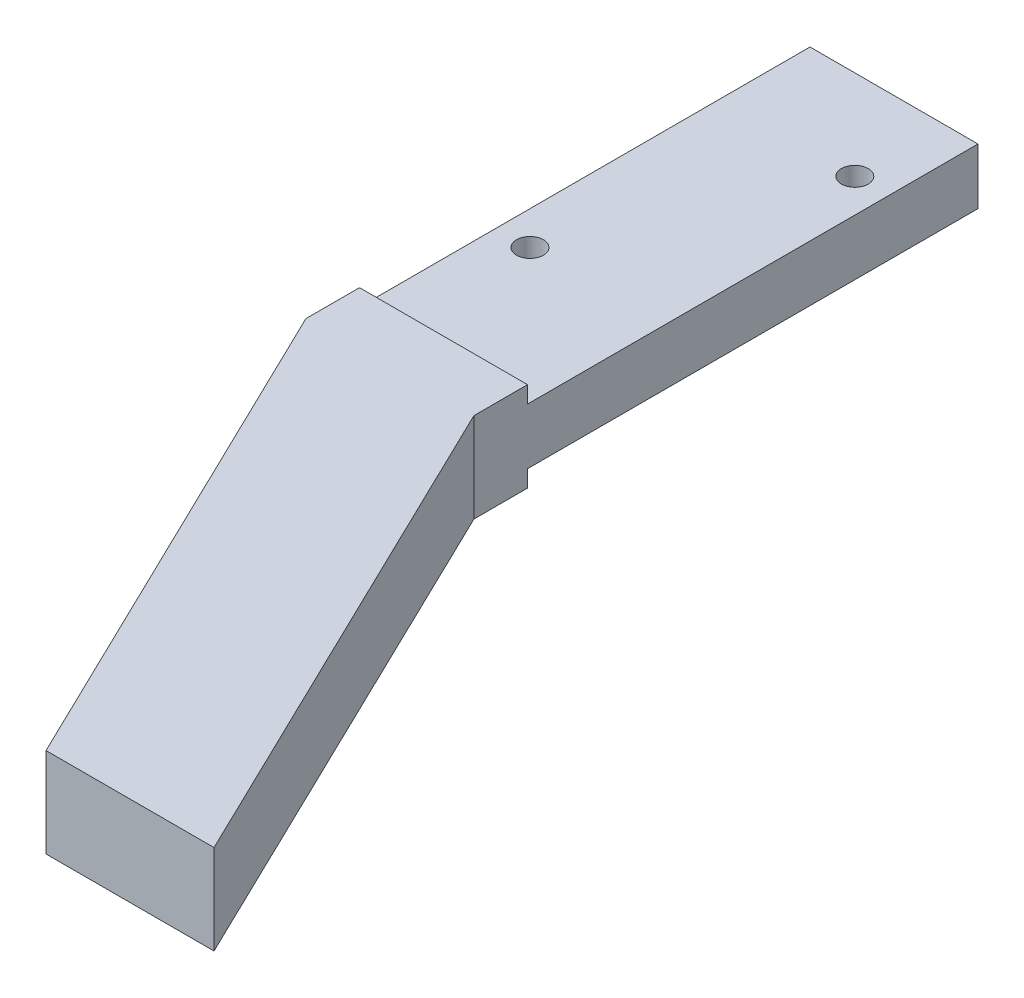
ISO-10303-21;
HEADER;
FILE_DESCRIPTION(('STEP AP214'),'2;1');
FILE_NAME('part.step','',(''),(''),'','','');
FILE_SCHEMA(('AUTOMOTIVE_DESIGN { 1 0 10303 214 1 1 1 1 }'));
ENDSEC;
DATA;
#1=APPLICATION_CONTEXT('core data for automotive mechanical design processes');
#2=APPLICATION_PROTOCOL_DEFINITION('international standard','automotive_design',2000,#1);
#3=PRODUCT_CONTEXT('',#1,'mechanical');
#4=PRODUCT('Part','Part','',(#3));
#5=PRODUCT_RELATED_PRODUCT_CATEGORY('part','',(#4));
#6=PRODUCT_DEFINITION_FORMATION('','',#4);
#7=PRODUCT_DEFINITION_CONTEXT('part definition',#1,'design');
#8=PRODUCT_DEFINITION('design','',#6,#7);
#9=PRODUCT_DEFINITION_SHAPE('','',#8);
#10=(LENGTH_UNIT() NAMED_UNIT(*) SI_UNIT(.MILLI.,.METRE.));
#11=(NAMED_UNIT(*) PLANE_ANGLE_UNIT() SI_UNIT($,.RADIAN.));
#12=(NAMED_UNIT(*) SI_UNIT($,.STERADIAN.) SOLID_ANGLE_UNIT());
#13=UNCERTAINTY_MEASURE_WITH_UNIT(LENGTH_MEASURE(1.E-05),#10,'distance_accuracy_value','');
#14=(GEOMETRIC_REPRESENTATION_CONTEXT(3) GLOBAL_UNCERTAINTY_ASSIGNED_CONTEXT((#13)) GLOBAL_UNIT_ASSIGNED_CONTEXT((#10,
#11,#12)) REPRESENTATION_CONTEXT('',''));
#15=CARTESIAN_POINT('',(0.,0.,0.));
#16=DIRECTION('',(0.,0.,1.));
#17=DIRECTION('',(1.,0.,0.));
#18=AXIS2_PLACEMENT_3D('',#15,#16,#17);
#19=CARTESIAN_POINT('',(0.,2.5,0.));
#20=DIRECTION('',(0.,1.,0.));
#21=DIRECTION('',(0.,0.,1.));
#22=AXIS2_PLACEMENT_3D('',#19,#20,#21);
#23=PLANE('',#22);
#24=DIRECTION('',(-1.,0.,0.));
#25=VECTOR('',#24,1.);
#26=CARTESIAN_POINT('',(0.,2.5,17.7156622283973));
#27=LINE('',#26,#25);
#28=CARTESIAN_POINT('',(7.5,2.5,17.7156622283973));
#29=VERTEX_POINT('',#28);
#30=CARTESIAN_POINT('',(-7.5,2.5,17.7156622283973));
#31=VERTEX_POINT('',#30);
#32=EDGE_CURVE('E70',#29,#31,#27,.T.);
#33=ORIENTED_EDGE('',*,*,#32,.F.);
#34=DIRECTION('',(0.,0.,-1.));
#35=VECTOR('',#34,1.);
#36=CARTESIAN_POINT('',(7.5,2.5,22.5));
#37=LINE('',#36,#35);
#38=CARTESIAN_POINT('',(7.5,2.5,-22.5));
#39=VERTEX_POINT('',#38);
#40=EDGE_CURVE('E192',#29,#39,#37,.T.);
#41=ORIENTED_EDGE('',*,*,#40,.T.);
#42=DIRECTION('',(-1.,0.,0.));
#43=VECTOR('',#42,1.);
#44=CARTESIAN_POINT('',(7.5,2.5,-22.5));
#45=LINE('',#44,#43);
#46=CARTESIAN_POINT('',(-7.5,2.5,-22.5));
#47=VERTEX_POINT('',#46);
#48=EDGE_CURVE('E50',#39,#47,#45,.T.);
#49=ORIENTED_EDGE('',*,*,#48,.T.);
#50=DIRECTION('',(0.,0.,1.));
#51=VECTOR('',#50,1.);
#52=CARTESIAN_POINT('',(-7.5,2.5,22.5));
#53=LINE('',#52,#51);
#54=EDGE_CURVE('E190',#47,#31,#53,.T.);
#55=ORIENTED_EDGE('',*,*,#54,.T.);
#56=EDGE_LOOP('',(#33,#41,#49,#55));
#57=FACE_BOUND('',#56,.T.);
#58=CARTESIAN_POINT('',(4.5,2.5,-14.5));
#59=DIRECTION('',(0.,1.,0.));
#60=DIRECTION('',(0.,0.,1.));
#61=AXIS2_PLACEMENT_3D('',#58,#59,#60);
#62=CIRCLE('',#61,1.2);
#63=CARTESIAN_POINT('',(4.5,2.5,-13.3));
#64=VERTEX_POINT('',#63);
#65=EDGE_CURVE('E185',#64,#64,#62,.T.);
#66=ORIENTED_EDGE('',*,*,#65,.F.);
#67=EDGE_LOOP('',(#66));
#68=FACE_BOUND('',#67,.T.);
#69=CARTESIAN_POINT('',(-4.5,2.5,5.50000000000001));
#70=DIRECTION('',(0.,1.,0.));
#71=DIRECTION('',(0.,0.,1.));
#72=AXIS2_PLACEMENT_3D('',#69,#70,#71);
#73=CIRCLE('',#72,1.2);
#74=CARTESIAN_POINT('',(-4.5,2.5,6.70000000000001));
#75=VERTEX_POINT('',#74);
#76=EDGE_CURVE('E179',#75,#75,#73,.T.);
#77=ORIENTED_EDGE('',*,*,#76,.F.);
#78=EDGE_LOOP('',(#77));
#79=FACE_BOUND('',#78,.T.);
#80=ADVANCED_FACE('F33',(#57,#68,#79),#23,.T.);
#81=CARTESIAN_POINT('',(0.,-2.5,0.));
#82=DIRECTION('',(0.,1.,0.));
#83=DIRECTION('',(0.,0.,1.));
#84=AXIS2_PLACEMENT_3D('',#81,#82,#83);
#85=PLANE('',#84);
#86=DIRECTION('',(0.,0.,-1.));
#87=VECTOR('',#86,1.);
#88=CARTESIAN_POINT('',(7.5,-2.5,22.5));
#89=LINE('',#88,#87);
#90=CARTESIAN_POINT('',(7.5,-2.5,17.7156622283973));
#91=VERTEX_POINT('',#90);
#92=CARTESIAN_POINT('',(7.5,-2.5,-22.5));
#93=VERTEX_POINT('',#92);
#94=EDGE_CURVE('E61',#91,#93,#89,.T.);
#95=ORIENTED_EDGE('',*,*,#94,.F.);
#96=DIRECTION('',(-1.,0.,0.));
#97=VECTOR('',#96,1.);
#98=CARTESIAN_POINT('',(0.,-2.5,17.7156622283973));
#99=LINE('',#98,#97);
#100=CARTESIAN_POINT('',(-7.5,-2.5,17.7156622283973));
#101=VERTEX_POINT('',#100);
#102=EDGE_CURVE('E171',#91,#101,#99,.T.);
#103=ORIENTED_EDGE('',*,*,#102,.T.);
#104=DIRECTION('',(0.,0.,1.));
#105=VECTOR('',#104,1.);
#106=CARTESIAN_POINT('',(-7.5,-2.5,22.5));
#107=LINE('',#106,#105);
#108=CARTESIAN_POINT('',(-7.5,-2.5,-22.5));
#109=VERTEX_POINT('',#108);
#110=EDGE_CURVE('E121',#109,#101,#107,.T.);
#111=ORIENTED_EDGE('',*,*,#110,.F.);
#112=DIRECTION('',(-1.,0.,0.));
#113=VECTOR('',#112,1.);
#114=CARTESIAN_POINT('',(7.5,-2.5,-22.5));
#115=LINE('',#114,#113);
#116=EDGE_CURVE('E193',#93,#109,#115,.T.);
#117=ORIENTED_EDGE('',*,*,#116,.F.);
#118=EDGE_LOOP('',(#95,#103,#111,#117));
#119=FACE_BOUND('',#118,.T.);
#120=CARTESIAN_POINT('',(4.5,-2.5,-14.5));
#121=DIRECTION('',(0.,1.,0.));
#122=DIRECTION('',(0.,0.,1.));
#123=AXIS2_PLACEMENT_3D('',#120,#121,#122);
#124=CIRCLE('',#123,1.2);
#125=CARTESIAN_POINT('',(4.5,-2.5,-13.3));
#126=VERTEX_POINT('',#125);
#127=EDGE_CURVE('E182',#126,#126,#124,.T.);
#128=ORIENTED_EDGE('',*,*,#127,.T.);
#129=EDGE_LOOP('',(#128));
#130=FACE_BOUND('',#129,.T.);
#131=CARTESIAN_POINT('',(-4.5,-2.5,5.50000000000001));
#132=DIRECTION('',(0.,1.,0.));
#133=DIRECTION('',(0.,0.,1.));
#134=AXIS2_PLACEMENT_3D('',#131,#132,#133);
#135=CIRCLE('',#134,1.2);
#136=CARTESIAN_POINT('',(-4.5,-2.5,6.70000000000001));
#137=VERTEX_POINT('',#136);
#138=EDGE_CURVE('E178',#137,#137,#135,.T.);
#139=ORIENTED_EDGE('',*,*,#138,.T.);
#140=EDGE_LOOP('',(#139));
#141=FACE_BOUND('',#140,.T.);
#142=ADVANCED_FACE('F226',(#119,#130,#141),#85,.F.);
#143=CARTESIAN_POINT('',(-7.5,2.5,22.5));
#144=DIRECTION('',(1.,0.,0.));
#145=DIRECTION('',(0.,0.,-1.));
#146=AXIS2_PLACEMENT_3D('',#143,#144,#145);
#147=PLANE('',#146);
#148=ORIENTED_EDGE('',*,*,#110,.T.);
#149=DIRECTION('',(0.,1.,0.));
#150=VECTOR('',#149,1.);
#151=CARTESIAN_POINT('',(-7.5,-4.,17.7156622283973));
#152=LINE('',#151,#150);
#153=CARTESIAN_POINT('',(-7.5,-4.,17.7156622283973));
#154=VERTEX_POINT('',#153);
#155=EDGE_CURVE('E116',#154,#101,#152,.T.);
#156=ORIENTED_EDGE('',*,*,#155,.F.);
#157=DIRECTION('',(0.,0.,1.));
#158=VECTOR('',#157,1.);
#159=CARTESIAN_POINT('',(-7.5,-4.,17.7156622283973));
#160=LINE('',#159,#158);
#161=CARTESIAN_POINT('',(-7.5,-4.,22.5));
#162=VERTEX_POINT('',#161);
#163=EDGE_CURVE('E118',#154,#162,#160,.T.);
#164=ORIENTED_EDGE('',*,*,#163,.T.);
#165=DIRECTION('',(0.,-1.,0.));
#166=VECTOR('',#165,1.);
#167=CARTESIAN_POINT('',(-7.5,2.5,22.5));
#168=LINE('',#167,#166);
#169=CARTESIAN_POINT('',(-7.5,4.,22.5));
#170=VERTEX_POINT('',#169);
#171=EDGE_CURVE('E11',#170,#162,#168,.T.);
#172=ORIENTED_EDGE('',*,*,#171,.F.);
#173=DIRECTION('',(0.,0.,1.));
#174=VECTOR('',#173,1.);
#175=CARTESIAN_POINT('',(-7.5,4.,17.7156622283973));
#176=LINE('',#175,#174);
#177=CARTESIAN_POINT('',(-7.5,4.,17.7156622283973));
#178=VERTEX_POINT('',#177);
#179=EDGE_CURVE('E159',#178,#170,#176,.T.);
#180=ORIENTED_EDGE('',*,*,#179,.F.);
#181=EDGE_CURVE('E126',#31,#178,#152,.T.);
#182=ORIENTED_EDGE('',*,*,#181,.F.);
#183=ORIENTED_EDGE('',*,*,#54,.F.);
#184=DIRECTION('',(0.,-1.,0.));
#185=VECTOR('',#184,1.);
#186=CARTESIAN_POINT('',(-7.5,2.5,-22.5));
#187=LINE('',#186,#185);
#188=EDGE_CURVE('E196',#47,#109,#187,.T.);
#189=ORIENTED_EDGE('',*,*,#188,.T.);
#190=EDGE_LOOP('',(#148,#156,#164,#172,#180,#182,#183,#189));
#191=FACE_BOUND('',#190,.T.);
#192=ADVANCED_FACE('F35',(#191),#147,.F.);
#193=CARTESIAN_POINT('',(7.5,2.5,22.5));
#194=DIRECTION('',(-1.,0.,0.));
#195=DIRECTION('',(0.,0.,1.));
#196=AXIS2_PLACEMENT_3D('',#193,#194,#195);
#197=PLANE('',#196);
#198=ORIENTED_EDGE('',*,*,#40,.F.);
#199=DIRECTION('',(0.,1.,0.));
#200=VECTOR('',#199,1.);
#201=CARTESIAN_POINT('',(7.5,-4.,17.7156622283973));
#202=LINE('',#201,#200);
#203=CARTESIAN_POINT('',(7.5,4.,17.7156622283973));
#204=VERTEX_POINT('',#203);
#205=EDGE_CURVE('E172',#29,#204,#202,.T.);
#206=ORIENTED_EDGE('',*,*,#205,.T.);
#207=DIRECTION('',(0.,0.,-1.));
#208=VECTOR('',#207,1.);
#209=CARTESIAN_POINT('',(7.5,4.,17.7156622283973));
#210=LINE('',#209,#208);
#211=CARTESIAN_POINT('',(7.5,4.,22.5));
#212=VERTEX_POINT('',#211);
#213=EDGE_CURVE('E141',#212,#204,#210,.T.);
#214=ORIENTED_EDGE('',*,*,#213,.F.);
#215=DIRECTION('',(0.,-1.,0.));
#216=VECTOR('',#215,1.);
#217=CARTESIAN_POINT('',(7.5,2.5,22.5));
#218=LINE('',#217,#216);
#219=CARTESIAN_POINT('',(7.5,-4.,22.5));
#220=VERTEX_POINT('',#219);
#221=EDGE_CURVE('E42',#212,#220,#218,.T.);
#222=ORIENTED_EDGE('',*,*,#221,.T.);
#223=DIRECTION('',(0.,0.,-1.));
#224=VECTOR('',#223,1.);
#225=CARTESIAN_POINT('',(7.5,-4.,17.7156622283973));
#226=LINE('',#225,#224);
#227=CARTESIAN_POINT('',(7.5,-4.,17.7156622283973));
#228=VERTEX_POINT('',#227);
#229=EDGE_CURVE('E154',#220,#228,#226,.T.);
#230=ORIENTED_EDGE('',*,*,#229,.T.);
#231=EDGE_CURVE('E140',#228,#91,#202,.T.);
#232=ORIENTED_EDGE('',*,*,#231,.T.);
#233=ORIENTED_EDGE('',*,*,#94,.T.);
#234=DIRECTION('',(0.,-1.,0.));
#235=VECTOR('',#234,1.);
#236=CARTESIAN_POINT('',(7.5,2.5,-22.5));
#237=LINE('',#236,#235);
#238=EDGE_CURVE('E201',#39,#93,#237,.T.);
#239=ORIENTED_EDGE('',*,*,#238,.F.);
#240=EDGE_LOOP('',(#198,#206,#214,#222,#230,#232,#233,#239));
#241=FACE_BOUND('',#240,.T.);
#242=ADVANCED_FACE('F204',(#241),#197,.F.);
#243=CARTESIAN_POINT('',(7.5,2.5,-22.5));
#244=DIRECTION('',(0.,0.,1.));
#245=DIRECTION('',(1.,0.,0.));
#246=AXIS2_PLACEMENT_3D('',#243,#244,#245);
#247=PLANE('',#246);
#248=ORIENTED_EDGE('',*,*,#116,.T.);
#249=ORIENTED_EDGE('',*,*,#188,.F.);
#250=ORIENTED_EDGE('',*,*,#48,.F.);
#251=ORIENTED_EDGE('',*,*,#238,.T.);
#252=EDGE_LOOP('',(#248,#249,#250,#251));
#253=FACE_BOUND('',#252,.T.);
#254=ADVANCED_FACE('F224',(#253),#247,.F.);
#255=CARTESIAN_POINT('',(4.5,2.5,-14.5));
#256=DIRECTION('',(0.,-1.,0.));
#257=DIRECTION('',(0.,0.,-1.));
#258=AXIS2_PLACEMENT_3D('',#255,#256,#257);
#259=CYLINDRICAL_SURFACE('',#258,1.2);
#260=ORIENTED_EDGE('',*,*,#65,.T.);
#261=EDGE_LOOP('',(#260));
#262=FACE_BOUND('',#261,.T.);
#263=ORIENTED_EDGE('',*,*,#127,.F.);
#264=EDGE_LOOP('',(#263));
#265=FACE_BOUND('',#264,.T.);
#266=ADVANCED_FACE('F236',(#262,#265),#259,.F.);
#267=CARTESIAN_POINT('',(-4.5,2.5,5.50000000000001));
#268=DIRECTION('',(0.,-1.,0.));
#269=DIRECTION('',(0.,0.,-1.));
#270=AXIS2_PLACEMENT_3D('',#267,#268,#269);
#271=CYLINDRICAL_SURFACE('',#270,1.2);
#272=ORIENTED_EDGE('',*,*,#76,.T.);
#273=EDGE_LOOP('',(#272));
#274=FACE_BOUND('',#273,.T.);
#275=ORIENTED_EDGE('',*,*,#138,.F.);
#276=EDGE_LOOP('',(#275));
#277=FACE_BOUND('',#276,.T.);
#278=ADVANCED_FACE('F234',(#274,#277),#271,.F.);
#279=CARTESIAN_POINT('',(-7.5,-4.,17.7156622283973));
#280=DIRECTION('',(0.,0.,-1.));
#281=DIRECTION('',(-1.,0.,0.));
#282=AXIS2_PLACEMENT_3D('',#279,#280,#281);
#283=PLANE('',#282);
#284=ORIENTED_EDGE('',*,*,#102,.F.);
#285=ORIENTED_EDGE('',*,*,#231,.F.);
#286=DIRECTION('',(-1.,0.,0.));
#287=VECTOR('',#286,1.);
#288=CARTESIAN_POINT('',(-7.5,-4.,17.7156622283973));
#289=LINE('',#288,#287);
#290=EDGE_CURVE('E133',#228,#154,#289,.T.);
#291=ORIENTED_EDGE('',*,*,#290,.T.);
#292=ORIENTED_EDGE('',*,*,#155,.T.);
#293=EDGE_LOOP('',(#284,#285,#291,#292));
#294=FACE_BOUND('',#293,.T.);
#295=ADVANCED_FACE('F139',(#294),#283,.T.);
#296=ORIENTED_EDGE('',*,*,#205,.F.);
#297=ORIENTED_EDGE('',*,*,#32,.T.);
#298=ORIENTED_EDGE('',*,*,#181,.T.);
#299=DIRECTION('',(-1.,0.,0.));
#300=VECTOR('',#299,1.);
#301=CARTESIAN_POINT('',(-7.5,4.,17.7156622283973));
#302=LINE('',#301,#300);
#303=EDGE_CURVE('E156',#204,#178,#302,.T.);
#304=ORIENTED_EDGE('',*,*,#303,.F.);
#305=EDGE_LOOP('',(#296,#297,#298,#304));
#306=FACE_BOUND('',#305,.T.);
#307=ADVANCED_FACE('F220',(#306),#283,.T.);
#308=CARTESIAN_POINT('',(29.2944947177034,-4.,67.5));
#309=DIRECTION('',(0.9,0.,-0.435889894354068));
#310=DIRECTION('',(-0.435889894354068,0.,-0.9));
#311=AXIS2_PLACEMENT_3D('',#308,#309,#310);
#312=PLANE('',#311);
#313=DIRECTION('',(-0.435889894354068,0.,-0.9));
#314=VECTOR('',#313,1.);
#315=CARTESIAN_POINT('',(29.2944947177034,4.,67.5));
#316=LINE('',#315,#314);
#317=CARTESIAN_POINT('',(29.2944947177034,4.,67.5));
#318=VERTEX_POINT('',#317);
#319=EDGE_CURVE('E144',#318,#212,#316,.T.);
#320=ORIENTED_EDGE('',*,*,#319,.F.);
#321=DIRECTION('',(0.,1.,0.));
#322=VECTOR('',#321,1.);
#323=CARTESIAN_POINT('',(29.2944947177034,-4.,67.5));
#324=LINE('',#323,#322);
#325=CARTESIAN_POINT('',(29.2944947177034,-4.,67.5));
#326=VERTEX_POINT('',#325);
#327=EDGE_CURVE('E173',#326,#318,#324,.T.);
#328=ORIENTED_EDGE('',*,*,#327,.F.);
#329=DIRECTION('',(-0.435889894354068,0.,-0.9));
#330=VECTOR('',#329,1.);
#331=CARTESIAN_POINT('',(29.2944947177034,-4.,67.5));
#332=LINE('',#331,#330);
#333=EDGE_CURVE('E151',#326,#220,#332,.T.);
#334=ORIENTED_EDGE('',*,*,#333,.T.);
#335=ORIENTED_EDGE('',*,*,#221,.F.);
#336=EDGE_LOOP('',(#320,#328,#334,#335));
#337=FACE_BOUND('',#336,.T.);
#338=ADVANCED_FACE('F208',(#337),#312,.T.);
#339=CARTESIAN_POINT('',(14.2944947177034,-4.,67.5));
#340=DIRECTION('',(0.,0.,1.));
#341=DIRECTION('',(1.,0.,0.));
#342=AXIS2_PLACEMENT_3D('',#339,#340,#341);
#343=PLANE('',#342);
#344=DIRECTION('',(1.,0.,0.));
#345=VECTOR('',#344,1.);
#346=CARTESIAN_POINT('',(14.2944947177034,4.,67.5));
#347=LINE('',#346,#345);
#348=CARTESIAN_POINT('',(14.2944947177034,4.,67.5));
#349=VERTEX_POINT('',#348);
#350=EDGE_CURVE('E165',#349,#318,#347,.T.);
#351=ORIENTED_EDGE('',*,*,#350,.F.);
#352=DIRECTION('',(0.,1.,0.));
#353=VECTOR('',#352,1.);
#354=CARTESIAN_POINT('',(14.2944947177034,-4.,67.5));
#355=LINE('',#354,#353);
#356=CARTESIAN_POINT('',(14.2944947177034,-4.,67.5));
#357=VERTEX_POINT('',#356);
#358=EDGE_CURVE('E125',#357,#349,#355,.T.);
#359=ORIENTED_EDGE('',*,*,#358,.F.);
#360=DIRECTION('',(1.,0.,0.));
#361=VECTOR('',#360,1.);
#362=CARTESIAN_POINT('',(14.2944947177034,-4.,67.5));
#363=LINE('',#362,#361);
#364=EDGE_CURVE('E148',#357,#326,#363,.T.);
#365=ORIENTED_EDGE('',*,*,#364,.T.);
#366=ORIENTED_EDGE('',*,*,#327,.T.);
#367=EDGE_LOOP('',(#351,#359,#365,#366));
#368=FACE_BOUND('',#367,.T.);
#369=ADVANCED_FACE('F211',(#368),#343,.T.);
#370=CARTESIAN_POINT('',(-7.5,-4.,22.5));
#371=DIRECTION('',(-0.9,0.,0.435889894354068));
#372=DIRECTION('',(0.435889894354068,0.,0.9));
#373=AXIS2_PLACEMENT_3D('',#370,#371,#372);
#374=PLANE('',#373);
#375=DIRECTION('',(0.435889894354068,0.,0.9));
#376=VECTOR('',#375,1.);
#377=CARTESIAN_POINT('',(-7.5,4.,22.5));
#378=LINE('',#377,#376);
#379=EDGE_CURVE('E162',#170,#349,#378,.T.);
#380=ORIENTED_EDGE('',*,*,#379,.F.);
#381=ORIENTED_EDGE('',*,*,#171,.T.);
#382=DIRECTION('',(0.435889894354068,0.,0.9));
#383=VECTOR('',#382,1.);
#384=CARTESIAN_POINT('',(-7.5,-4.,22.5));
#385=LINE('',#384,#383);
#386=EDGE_CURVE('E137',#162,#357,#385,.T.);
#387=ORIENTED_EDGE('',*,*,#386,.T.);
#388=ORIENTED_EDGE('',*,*,#358,.T.);
#389=EDGE_LOOP('',(#380,#381,#387,#388));
#390=FACE_BOUND('',#389,.T.);
#391=ADVANCED_FACE('F214',(#390),#374,.T.);
#392=CARTESIAN_POINT('',(0.,-4.,0.));
#393=DIRECTION('',(0.,-1.,0.));
#394=DIRECTION('',(0.,0.,-1.));
#395=AXIS2_PLACEMENT_3D('',#392,#393,#394);
#396=PLANE('',#395);
#397=ORIENTED_EDGE('',*,*,#290,.F.);
#398=ORIENTED_EDGE('',*,*,#229,.F.);
#399=ORIENTED_EDGE('',*,*,#333,.F.);
#400=ORIENTED_EDGE('',*,*,#364,.F.);
#401=ORIENTED_EDGE('',*,*,#386,.F.);
#402=ORIENTED_EDGE('',*,*,#163,.F.);
#403=EDGE_LOOP('',(#397,#398,#399,#400,#401,#402));
#404=FACE_BOUND('',#403,.T.);
#405=ADVANCED_FACE('F131',(#404),#396,.T.);
#406=CARTESIAN_POINT('',(0.,4.,0.));
#407=DIRECTION('',(0.,-1.,0.));
#408=DIRECTION('',(0.,0.,-1.));
#409=AXIS2_PLACEMENT_3D('',#406,#407,#408);
#410=PLANE('',#409);
#411=ORIENTED_EDGE('',*,*,#303,.T.);
#412=ORIENTED_EDGE('',*,*,#179,.T.);
#413=ORIENTED_EDGE('',*,*,#379,.T.);
#414=ORIENTED_EDGE('',*,*,#350,.T.);
#415=ORIENTED_EDGE('',*,*,#319,.T.);
#416=ORIENTED_EDGE('',*,*,#213,.T.);
#417=EDGE_LOOP('',(#411,#412,#413,#414,#415,#416));
#418=FACE_BOUND('',#417,.T.);
#419=ADVANCED_FACE('F219',(#418),#410,.F.);
#420=CLOSED_SHELL('',(#80,#142,#192,#242,#254,#266,#278,#295,#307,#338,#369,#391,#405,#419));
#421=MANIFOLD_SOLID_BREP('B2',#420);
#422=ADVANCED_BREP_SHAPE_REPRESENTATION('',(#18,#421),#14);
#423=SHAPE_DEFINITION_REPRESENTATION(#9,#422);
ENDSEC;
END-ISO-10303-21;
